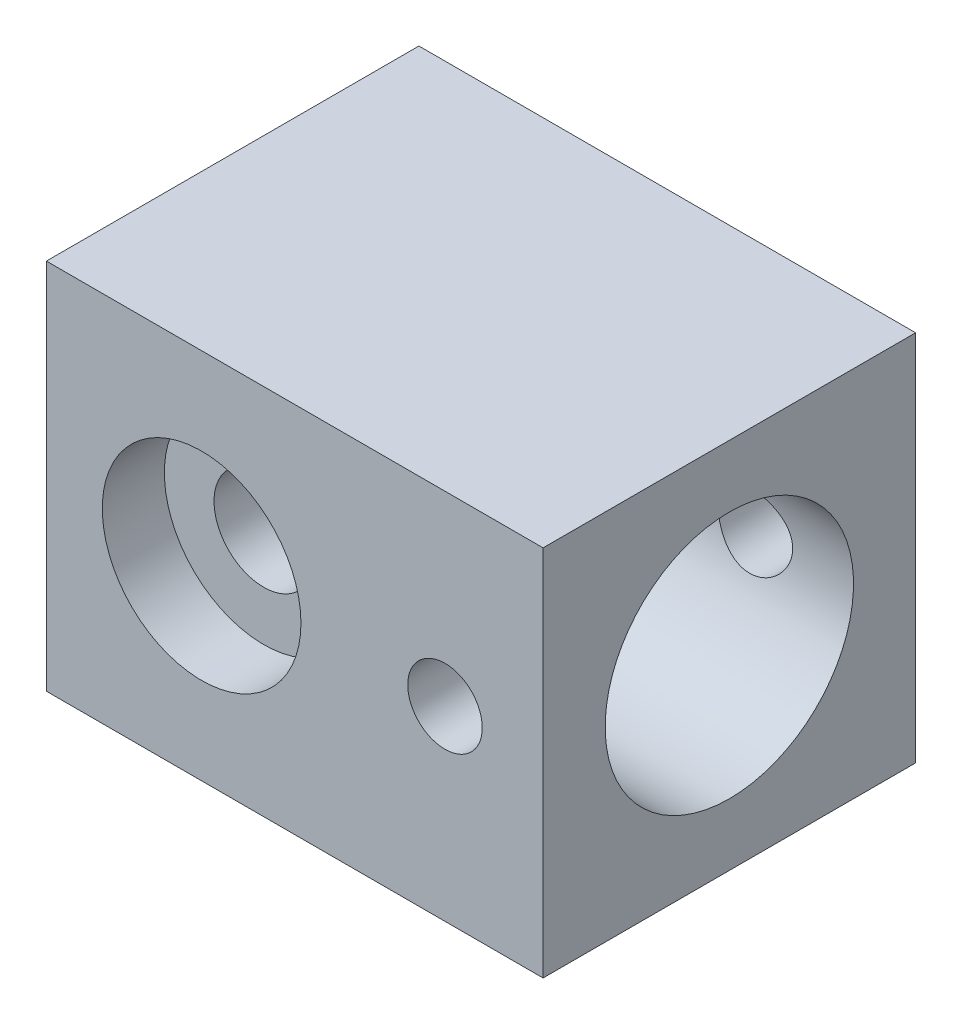
ISO-10303-21;
HEADER;
FILE_DESCRIPTION(('STEP AP214'),'2;1');
FILE_NAME('part.step','',(''),(''),'','','');
FILE_SCHEMA(('AUTOMOTIVE_DESIGN { 1 0 10303 214 1 1 1 1 }'));
ENDSEC;
DATA;
#1=APPLICATION_CONTEXT('core data for automotive mechanical design processes');
#2=APPLICATION_PROTOCOL_DEFINITION('international standard','automotive_design',2000,#1);
#3=PRODUCT_CONTEXT('',#1,'mechanical');
#4=PRODUCT('Part','Part','',(#3));
#5=PRODUCT_RELATED_PRODUCT_CATEGORY('part','',(#4));
#6=PRODUCT_DEFINITION_FORMATION('','',#4);
#7=PRODUCT_DEFINITION_CONTEXT('part definition',#1,'design');
#8=PRODUCT_DEFINITION('design','',#6,#7);
#9=PRODUCT_DEFINITION_SHAPE('','',#8);
#10=(LENGTH_UNIT() NAMED_UNIT(*) SI_UNIT(.MILLI.,.METRE.));
#11=(NAMED_UNIT(*) PLANE_ANGLE_UNIT() SI_UNIT($,.RADIAN.));
#12=(NAMED_UNIT(*) SI_UNIT($,.STERADIAN.) SOLID_ANGLE_UNIT());
#13=UNCERTAINTY_MEASURE_WITH_UNIT(LENGTH_MEASURE(1.E-05),#10,'distance_accuracy_value','');
#14=(GEOMETRIC_REPRESENTATION_CONTEXT(3) GLOBAL_UNCERTAINTY_ASSIGNED_CONTEXT((#13)) GLOBAL_UNIT_ASSIGNED_CONTEXT((#10,
#11,#12)) REPRESENTATION_CONTEXT('',''));
#15=CARTESIAN_POINT('',(0.,0.,0.));
#16=DIRECTION('',(0.,0.,1.));
#17=DIRECTION('',(1.,0.,0.));
#18=AXIS2_PLACEMENT_3D('',#15,#16,#17);
#19=CARTESIAN_POINT('',(0.,0.,0.));
#20=DIRECTION('',(0.,0.,1.));
#21=DIRECTION('',(1.,0.,0.));
#22=AXIS2_PLACEMENT_3D('',#19,#20,#21);
#23=PLANE('',#22);
#24=DIRECTION('',(0.,-1.,0.));
#25=VECTOR('',#24,1.);
#26=CARTESIAN_POINT('',(0.,0.,0.));
#27=LINE('',#26,#25);
#28=CARTESIAN_POINT('',(0.,0.,0.));
#29=VERTEX_POINT('',#28);
#30=CARTESIAN_POINT('',(0.,-30.,0.));
#31=VERTEX_POINT('',#30);
#32=EDGE_CURVE('E118',#29,#31,#27,.T.);
#33=ORIENTED_EDGE('',*,*,#32,.F.);
#34=DIRECTION('',(-1.,0.,0.));
#35=VECTOR('',#34,1.);
#36=CARTESIAN_POINT('',(0.,0.,0.));
#37=LINE('',#36,#35);
#38=CARTESIAN_POINT('',(40.,0.,0.));
#39=VERTEX_POINT('',#38);
#40=EDGE_CURVE('E93',#39,#29,#37,.T.);
#41=ORIENTED_EDGE('',*,*,#40,.F.);
#42=DIRECTION('',(0.,1.,0.));
#43=VECTOR('',#42,1.);
#44=CARTESIAN_POINT('',(40.,0.,0.));
#45=LINE('',#44,#43);
#46=CARTESIAN_POINT('',(40.,-30.,0.));
#47=VERTEX_POINT('',#46);
#48=EDGE_CURVE('E87',#47,#39,#45,.T.);
#49=ORIENTED_EDGE('',*,*,#48,.F.);
#50=DIRECTION('',(1.,0.,0.));
#51=VECTOR('',#50,1.);
#52=CARTESIAN_POINT('',(0.,-30.,0.));
#53=LINE('',#52,#51);
#54=EDGE_CURVE('E109',#31,#47,#53,.T.);
#55=ORIENTED_EDGE('',*,*,#54,.F.);
#56=EDGE_LOOP('',(#33,#41,#49,#55));
#57=FACE_BOUND('',#56,.T.);
#58=CARTESIAN_POINT('',(32.1,-15.,0.));
#59=DIRECTION('',(0.,0.,1.));
#60=DIRECTION('',(1.,0.,0.));
#61=AXIS2_PLACEMENT_3D('',#58,#59,#60);
#62=CIRCLE('',#61,3.);
#63=CARTESIAN_POINT('',(35.1,-15.,0.));
#64=VERTEX_POINT('',#63);
#65=EDGE_CURVE('E200',#64,#64,#62,.T.);
#66=ORIENTED_EDGE('',*,*,#65,.T.);
#67=EDGE_LOOP('',(#66));
#68=FACE_BOUND('',#67,.T.);
#69=CARTESIAN_POINT('',(12.5,-15.,0.));
#70=DIRECTION('',(0.,0.,1.));
#71=DIRECTION('',(1.,0.,0.));
#72=AXIS2_PLACEMENT_3D('',#69,#70,#71);
#73=CIRCLE('',#72,8.);
#74=CARTESIAN_POINT('',(20.5,-15.,0.));
#75=VERTEX_POINT('',#74);
#76=EDGE_CURVE('E206',#75,#75,#73,.T.);
#77=ORIENTED_EDGE('',*,*,#76,.T.);
#78=EDGE_LOOP('',(#77));
#79=FACE_BOUND('',#78,.T.);
#80=ADVANCED_FACE('F46',(#57,#68,#79),#23,.F.);
#81=CARTESIAN_POINT('',(12.5,-15.,-71.));
#82=DIRECTION('',(0.,0.,1.));
#83=DIRECTION('',(1.,0.,0.));
#84=AXIS2_PLACEMENT_3D('',#81,#82,#83);
#85=CYLINDRICAL_SURFACE('',#84,4.);
#86=CARTESIAN_POINT('',(12.5,-15.,25.));
#87=DIRECTION('',(0.,0.,1.));
#88=DIRECTION('',(1.,0.,0.));
#89=AXIS2_PLACEMENT_3D('',#86,#87,#88);
#90=CIRCLE('',#89,4.);
#91=CARTESIAN_POINT('',(16.5,-15.,25.));
#92=VERTEX_POINT('',#91);
#93=EDGE_CURVE('E195',#92,#92,#90,.T.);
#94=ORIENTED_EDGE('',*,*,#93,.T.);
#95=EDGE_LOOP('',(#94));
#96=FACE_BOUND('',#95,.T.);
#97=CARTESIAN_POINT('',(12.5,-15.,5.));
#98=DIRECTION('',(0.,0.,1.));
#99=DIRECTION('',(1.,0.,0.));
#100=AXIS2_PLACEMENT_3D('',#97,#98,#99);
#101=CIRCLE('',#100,4.);
#102=CARTESIAN_POINT('',(16.5,-15.,5.));
#103=VERTEX_POINT('',#102);
#104=EDGE_CURVE('E209',#103,#103,#101,.T.);
#105=ORIENTED_EDGE('',*,*,#104,.F.);
#106=EDGE_LOOP('',(#105));
#107=FACE_BOUND('',#106,.T.);
#108=ADVANCED_FACE('F146',(#96,#107),#85,.F.);
#109=CARTESIAN_POINT('',(0.,0.,30.));
#110=DIRECTION('',(1.,0.,0.));
#111=DIRECTION('',(0.,0.,-1.));
#112=AXIS2_PLACEMENT_3D('',#109,#110,#111);
#113=PLANE('',#112);
#114=ORIENTED_EDGE('',*,*,#32,.T.);
#115=DIRECTION('',(0.,0.,-1.));
#116=VECTOR('',#115,1.);
#117=CARTESIAN_POINT('',(0.,-30.,30.));
#118=LINE('',#117,#116);
#119=CARTESIAN_POINT('',(0.,-30.,30.));
#120=VERTEX_POINT('',#119);
#121=EDGE_CURVE('E12',#120,#31,#118,.T.);
#122=ORIENTED_EDGE('',*,*,#121,.F.);
#123=DIRECTION('',(0.,-1.,0.));
#124=VECTOR('',#123,1.);
#125=CARTESIAN_POINT('',(0.,0.,30.));
#126=LINE('',#125,#124);
#127=CARTESIAN_POINT('',(0.,0.,30.));
#128=VERTEX_POINT('',#127);
#129=EDGE_CURVE('E105',#128,#120,#126,.T.);
#130=ORIENTED_EDGE('',*,*,#129,.F.);
#131=DIRECTION('',(0.,0.,-1.));
#132=VECTOR('',#131,1.);
#133=CARTESIAN_POINT('',(0.,0.,30.));
#134=LINE('',#133,#132);
#135=EDGE_CURVE('E114',#128,#29,#134,.T.);
#136=ORIENTED_EDGE('',*,*,#135,.T.);
#137=EDGE_LOOP('',(#114,#122,#130,#136));
#138=FACE_BOUND('',#137,.T.);
#139=ADVANCED_FACE('F48',(#138),#113,.F.);
#140=CARTESIAN_POINT('',(0.,-30.,30.));
#141=DIRECTION('',(0.,1.,0.));
#142=DIRECTION('',(0.,0.,1.));
#143=AXIS2_PLACEMENT_3D('',#140,#141,#142);
#144=PLANE('',#143);
#145=ORIENTED_EDGE('',*,*,#54,.T.);
#146=DIRECTION('',(0.,0.,-1.));
#147=VECTOR('',#146,1.);
#148=CARTESIAN_POINT('',(40.,-30.,30.));
#149=LINE('',#148,#147);
#150=CARTESIAN_POINT('',(40.,-30.,30.));
#151=VERTEX_POINT('',#150);
#152=EDGE_CURVE('E61',#151,#47,#149,.T.);
#153=ORIENTED_EDGE('',*,*,#152,.F.);
#154=DIRECTION('',(1.,0.,0.));
#155=VECTOR('',#154,1.);
#156=CARTESIAN_POINT('',(0.,-30.,30.));
#157=LINE('',#156,#155);
#158=EDGE_CURVE('E100',#120,#151,#157,.T.);
#159=ORIENTED_EDGE('',*,*,#158,.F.);
#160=ORIENTED_EDGE('',*,*,#121,.T.);
#161=EDGE_LOOP('',(#145,#153,#159,#160));
#162=FACE_BOUND('',#161,.T.);
#163=ADVANCED_FACE('F108',(#162),#144,.F.);
#164=CARTESIAN_POINT('',(40.,0.,30.));
#165=DIRECTION('',(-1.,0.,0.));
#166=DIRECTION('',(0.,-1.,0.));
#167=AXIS2_PLACEMENT_3D('',#164,#165,#166);
#168=PLANE('',#167);
#169=CARTESIAN_POINT('',(40.,-15.,15.));
#170=DIRECTION('',(1.,0.,0.));
#171=DIRECTION('',(0.,1.,0.));
#172=AXIS2_PLACEMENT_3D('',#169,#170,#171);
#173=CIRCLE('',#172,10.);
#174=CARTESIAN_POINT('',(40.,-5.,15.));
#175=VERTEX_POINT('',#174);
#176=EDGE_CURVE('E187',#175,#175,#173,.T.);
#177=ORIENTED_EDGE('',*,*,#176,.F.);
#178=EDGE_LOOP('',(#177));
#179=FACE_BOUND('',#178,.T.);
#180=ORIENTED_EDGE('',*,*,#48,.T.);
#181=DIRECTION('',(0.,0.,-1.));
#182=VECTOR('',#181,1.);
#183=CARTESIAN_POINT('',(40.,0.,30.));
#184=LINE('',#183,#182);
#185=CARTESIAN_POINT('',(40.,0.,30.));
#186=VERTEX_POINT('',#185);
#187=EDGE_CURVE('E110',#186,#39,#184,.T.);
#188=ORIENTED_EDGE('',*,*,#187,.F.);
#189=DIRECTION('',(0.,1.,0.));
#190=VECTOR('',#189,1.);
#191=CARTESIAN_POINT('',(40.,0.,30.));
#192=LINE('',#191,#190);
#193=EDGE_CURVE('E103',#151,#186,#192,.T.);
#194=ORIENTED_EDGE('',*,*,#193,.F.);
#195=ORIENTED_EDGE('',*,*,#152,.T.);
#196=EDGE_LOOP('',(#180,#188,#194,#195));
#197=FACE_BOUND('',#196,.T.);
#198=ADVANCED_FACE('F112',(#179,#197),#168,.F.);
#199=CARTESIAN_POINT('',(0.,0.,30.));
#200=DIRECTION('',(0.,-1.,0.));
#201=DIRECTION('',(0.,0.,-1.));
#202=AXIS2_PLACEMENT_3D('',#199,#200,#201);
#203=PLANE('',#202);
#204=ORIENTED_EDGE('',*,*,#40,.T.);
#205=ORIENTED_EDGE('',*,*,#135,.F.);
#206=DIRECTION('',(-1.,0.,0.));
#207=VECTOR('',#206,1.);
#208=CARTESIAN_POINT('',(0.,0.,30.));
#209=LINE('',#208,#207);
#210=EDGE_CURVE('E70',#186,#128,#209,.T.);
#211=ORIENTED_EDGE('',*,*,#210,.F.);
#212=ORIENTED_EDGE('',*,*,#187,.T.);
#213=EDGE_LOOP('',(#204,#205,#211,#212));
#214=FACE_BOUND('',#213,.T.);
#215=ADVANCED_FACE('F174',(#214),#203,.F.);
#216=CARTESIAN_POINT('',(0.,0.,30.));
#217=DIRECTION('',(0.,0.,1.));
#218=DIRECTION('',(1.,0.,0.));
#219=AXIS2_PLACEMENT_3D('',#216,#217,#218);
#220=PLANE('',#219);
#221=CARTESIAN_POINT('',(32.1,-15.,30.));
#222=DIRECTION('',(0.,0.,1.));
#223=DIRECTION('',(1.,0.,0.));
#224=AXIS2_PLACEMENT_3D('',#221,#222,#223);
#225=CIRCLE('',#224,3.);
#226=CARTESIAN_POINT('',(35.1,-15.,30.));
#227=VERTEX_POINT('',#226);
#228=EDGE_CURVE('E131',#227,#227,#225,.T.);
#229=ORIENTED_EDGE('',*,*,#228,.F.);
#230=EDGE_LOOP('',(#229));
#231=FACE_BOUND('',#230,.T.);
#232=CARTESIAN_POINT('',(12.5,-15.,30.));
#233=DIRECTION('',(0.,0.,1.));
#234=DIRECTION('',(1.,0.,0.));
#235=AXIS2_PLACEMENT_3D('',#232,#233,#234);
#236=CIRCLE('',#235,8.);
#237=CARTESIAN_POINT('',(20.5,-15.,30.));
#238=VERTEX_POINT('',#237);
#239=EDGE_CURVE('E192',#238,#238,#236,.T.);
#240=ORIENTED_EDGE('',*,*,#239,.F.);
#241=EDGE_LOOP('',(#240));
#242=FACE_BOUND('',#241,.T.);
#243=ORIENTED_EDGE('',*,*,#129,.T.);
#244=ORIENTED_EDGE('',*,*,#158,.T.);
#245=ORIENTED_EDGE('',*,*,#193,.T.);
#246=ORIENTED_EDGE('',*,*,#210,.T.);
#247=EDGE_LOOP('',(#243,#244,#245,#246));
#248=FACE_BOUND('',#247,.T.);
#249=ADVANCED_FACE('F101',(#231,#242,#248),#220,.T.);
#250=CARTESIAN_POINT('',(25.,-15.,15.));
#251=DIRECTION('',(1.,0.,0.));
#252=DIRECTION('',(0.,1.,0.));
#253=AXIS2_PLACEMENT_3D('',#250,#251,#252);
#254=CYLINDRICAL_SURFACE('',#253,10.);
#255=CARTESIAN_POINT('',(35.1,-15.,5.));
#256=CARTESIAN_POINT('',(35.0999980050302,-15.1645772255066,5.00000141498899));
#257=CARTESIAN_POINT('',(35.0864122727521,-15.3291746367031,5.00410168612092));
#258=CARTESIAN_POINT('',(35.0325572915558,-15.6535762506098,5.02005788812618));
#259=CARTESIAN_POINT('',(34.9922800839533,-15.8133790088228,5.03191613220616));
#260=CARTESIAN_POINT('',(34.8865079661795,-16.1234654155091,5.06208894996327));
#261=CARTESIAN_POINT('',(34.8210502607621,-16.2737627287907,5.08039399499149));
#262=CARTESIAN_POINT('',(34.6669278138883,-16.5612483621063,5.12155781524709));
#263=CARTESIAN_POINT('',(34.5782599852092,-16.6984349349393,5.14441719615867));
#264=CARTESIAN_POINT('',(34.3775519850547,-16.9597435943675,5.19298525614452));
#265=CARTESIAN_POINT('',(34.2649667482282,-17.0834361424887,5.21875232685927));
#266=CARTESIAN_POINT('',(34.0207815401796,-17.3104984184665,5.26988331579116));
#267=CARTESIAN_POINT('',(33.8891783757501,-17.4138647265488,5.29524716550997));
#268=CARTESIAN_POINT('',(33.6070584939248,-17.5996007544741,5.34331772012456));
#269=CARTESIAN_POINT('',(33.4561830780185,-17.6814461804443,5.36595186672251));
#270=CARTESIAN_POINT('',(33.1420214915394,-17.8184278954952,5.40512759211938));
#271=CARTESIAN_POINT('',(32.9787383121441,-17.8735705983995,5.42167063373379));
#272=CARTESIAN_POINT('',(32.6492194677391,-17.954032673653,5.44618258323131));
#273=CARTESIAN_POINT('',(32.4831945122721,-17.9801439246936,5.45437861350933));
#274=CARTESIAN_POINT('',(32.1489336875665,-18.0042746122934,5.46194420500466));
#275=CARTESIAN_POINT('',(31.9806983638818,-18.0023008552216,5.46131590478858));
#276=CARTESIAN_POINT('',(31.653232182783,-17.9709395439962,5.45150511864444));
#277=CARTESIAN_POINT('',(31.4938954992755,-17.9425441052537,5.44263222801719));
#278=CARTESIAN_POINT('',(31.1823604274531,-17.8607484085411,5.41783287542752));
#279=CARTESIAN_POINT('',(31.0301627452513,-17.8073456828328,5.40190571735299));
#280=CARTESIAN_POINT('',(30.7347993006785,-17.6763205330736,5.36454533850054));
#281=CARTESIAN_POINT('',(30.5917858320895,-17.5983763386929,5.34303967768096));
#282=CARTESIAN_POINT('',(30.3205359559796,-17.4207044517737,5.29698025999871));
#283=CARTESIAN_POINT('',(30.1923031411724,-17.3209714800518,5.27242576506018));
#284=CARTESIAN_POINT('',(29.948627618476,-17.0976258153109,5.22177977404125));
#285=CARTESIAN_POINT('',(29.8339426719407,-16.9731898149339,5.19566691379004));
#286=CARTESIAN_POINT('',(29.6268920318715,-16.7065265186279,5.14575511873483));
#287=CARTESIAN_POINT('',(29.5345277431712,-16.5642981037218,5.1219563296318));
#288=CARTESIAN_POINT('',(29.3742801550705,-16.2647100766856,5.07913679861059));
#289=CARTESIAN_POINT('',(29.3065649675003,-16.1072554994959,5.06014912663372));
#290=CARTESIAN_POINT('',(29.1988008198007,-15.782490831207,5.02932956335556));
#291=CARTESIAN_POINT('',(29.158744142935,-15.6151835031792,5.01749567626001));
#292=CARTESIAN_POINT('',(29.1086956442012,-15.2819044853367,5.00263270712924));
#293=CARTESIAN_POINT('',(29.0976768283968,-15.1161001952024,4.9993029916442));
#294=CARTESIAN_POINT('',(29.1031383114242,-14.7850007883532,5.00094153516481));
#295=CARTESIAN_POINT('',(29.1196149393029,-14.6197056066184,5.00590868644486));
#296=CARTESIAN_POINT('',(29.178769222223,-14.2981927893806,5.02338606025676));
#297=CARTESIAN_POINT('',(29.2208467751617,-14.1418544547717,5.03572340401172));
#298=CARTESIAN_POINT('',(29.3292864655564,-13.838490722091,5.0665130431693));
#299=CARTESIAN_POINT('',(29.3956515220757,-13.6914664459488,5.08496607357813));
#300=CARTESIAN_POINT('',(29.5525063309623,-13.4071256210779,5.12660691297369));
#301=CARTESIAN_POINT('',(29.643518681896,-13.2701123476007,5.1498943834072));
#302=CARTESIAN_POINT('',(29.8464495081056,-13.0129533840397,5.19853062471296));
#303=CARTESIAN_POINT('',(29.9583732237753,-12.8928119352881,5.22387991137581));
#304=CARTESIAN_POINT('',(30.2047746167387,-12.6682851089795,5.27493656261994));
#305=CARTESIAN_POINT('',(30.3399237515437,-12.56463037537,5.30062349934487));
#306=CARTESIAN_POINT('',(30.6262558780269,-12.3814200985569,5.34846969522051));
#307=CARTESIAN_POINT('',(30.7774384491158,-12.3018639234104,5.37062904686879));
#308=CARTESIAN_POINT('',(31.09106498251,-12.1696530574568,5.40865620773691));
#309=CARTESIAN_POINT('',(31.2534523730757,-12.1168730612598,5.424553243265));
#310=CARTESIAN_POINT('',(31.5853759378605,-12.0395653836969,5.44816811260263));
#311=CARTESIAN_POINT('',(31.7549096415661,-12.0150280204215,5.45588874930613));
#312=CARTESIAN_POINT('',(32.0887230367768,-11.9955603103007,5.46200055058442));
#313=CARTESIAN_POINT('',(32.2529273020988,-11.9994388938411,5.46076705299606));
#314=CARTESIAN_POINT('',(32.5782282068012,-12.0338498911139,5.45001197607812));
#315=CARTESIAN_POINT('',(32.739324970361,-12.0643812375059,5.44049072864099));
#316=CARTESIAN_POINT('',(33.0518907982633,-12.1504622239131,5.41448472610757));
#317=CARTESIAN_POINT('',(33.2034545747174,-12.2056964898575,5.39808790895067));
#318=CARTESIAN_POINT('',(33.4952848776414,-12.3393698575785,5.36019442194735));
#319=CARTESIAN_POINT('',(33.6355492352832,-12.4178134007428,5.3386967761492));
#320=CARTESIAN_POINT('',(33.9063262330525,-12.5990247238982,5.29204647144662));
#321=CARTESIAN_POINT('',(34.0362975225204,-12.70257447814,5.2667891967142));
#322=CARTESIAN_POINT('',(34.2774049966162,-12.9296513074044,5.21597359100934));
#323=CARTESIAN_POINT('',(34.3885362789356,-13.053183565731,5.19041518352458));
#324=CARTESIAN_POINT('',(34.5920468245899,-13.3210684756335,5.14098126858427));
#325=CARTESIAN_POINT('',(34.6837828937109,-13.4659242284188,5.11717680468579));
#326=CARTESIAN_POINT('',(34.8414703398081,-13.7697172520329,5.07478639088448));
#327=CARTESIAN_POINT('',(34.907433776549,-13.9286478940021,5.05619800137886));
#328=CARTESIAN_POINT('',(35.0057905513055,-14.2384845746894,5.02795650061381));
#329=CARTESIAN_POINT('',(35.0410233457665,-14.3884260760915,5.0175594523786));
#330=CARTESIAN_POINT('',(35.0881270504832,-14.6922396095384,5.0035811101102));
#331=CARTESIAN_POINT('',(35.1000018654096,-14.8461109802837,4.99999867690521));
#332=CARTESIAN_POINT('',(35.1,-15.,5.));
#333=B_SPLINE_CURVE_WITH_KNOTS('',3,(#255,#256,#257,#258,#259,#260,#261,#262,#263,#264,#265,
#266,#267,#268,#269,#270,#271,#272,#273,#274,#275,#276,#277,#278,#279,#280,#281,#282,#283,#284,
#285,#286,#287,#288,#289,#290,#291,#292,#293,#294,#295,#296,#297,#298,#299,#300,#301,#302,#303,
#304,#305,#306,#307,#308,#309,#310,#311,#312,#313,#314,#315,#316,#317,#318,#319,#320,#321,#322,
#323,#324,#325,#326,#327,#328,#329,#330,#331,#332),.UNSPECIFIED.,.T.,.F.,(4,2,2,2,2,2,2,2,2,2,2,
2,2,2,2,2,2,2,2,2,2,2,2,2,2,2,2,2,2,2,2,2,2,2,2,2,2,2,4),(0.,0.493166407225221,
0.986479929691998,1.47906735260175,1.9717203288254,2.47711205896382,2.98258874577265,
3.49942962008217,4.01614629086447,4.51839378713198,5.02051956638179,5.50452033395352,
5.98856887316002,6.47924852894239,6.97004720317111,7.48134208096333,7.99266913062143,
8.50742093763378,9.02202907057616,9.5181761887709,10.0142570710065,10.4991349336465,
10.9840710918746,11.4802261140582,11.9765056400038,12.4908080064564,13.0050968850536,
13.516956299025,14.0286401892057,14.5190031093854,15.0093463933232,15.4936008081456,
15.9779479511534,16.4799385136898,16.9820594980413,17.4988599232246,18.0154182319959,
18.4766338387004,18.9377723390687),.UNSPECIFIED.);
#334=CARTESIAN_POINT('',(35.1,-15.,5.));
#335=VERTEX_POINT('',#334);
#336=EDGE_CURVE('E50',#335,#335,#333,.T.);
#337=ORIENTED_EDGE('',*,*,#336,.T.);
#338=EDGE_LOOP('',(#337));
#339=FACE_BOUND('',#338,.T.);
#340=CARTESIAN_POINT('',(35.1,-15.,25.));
#341=CARTESIAN_POINT('',(35.0999980050302,-14.8354227744934,24.999998585011));
#342=CARTESIAN_POINT('',(35.0864122727521,-14.6708253632969,24.9958983138791));
#343=CARTESIAN_POINT('',(35.0325572915558,-14.3464237493902,24.9799421118738));
#344=CARTESIAN_POINT('',(34.9922800839533,-14.1866209911772,24.9680838677938));
#345=CARTESIAN_POINT('',(34.8865079661795,-13.8765345844909,24.9379110500367));
#346=CARTESIAN_POINT('',(34.8210502607621,-13.7262372712093,24.9196060050085));
#347=CARTESIAN_POINT('',(34.6669278138883,-13.4387516378937,24.8784421847529));
#348=CARTESIAN_POINT('',(34.5782599852092,-13.3015650650607,24.8555828038413));
#349=CARTESIAN_POINT('',(34.3775519850547,-13.0402564056325,24.8070147438555));
#350=CARTESIAN_POINT('',(34.2649667482282,-12.9165638575113,24.7812476731407));
#351=CARTESIAN_POINT('',(34.0207815401796,-12.6895015815335,24.7301166842088));
#352=CARTESIAN_POINT('',(33.8891783757501,-12.5861352734512,24.70475283449));
#353=CARTESIAN_POINT('',(33.6070584939248,-12.4003992455258,24.6566822798754));
#354=CARTESIAN_POINT('',(33.4561830780185,-12.3185538195557,24.6340481332775));
#355=CARTESIAN_POINT('',(33.1420214915394,-12.1815721045048,24.5948724078806));
#356=CARTESIAN_POINT('',(32.9787383121441,-12.1264294016005,24.5783293662662));
#357=CARTESIAN_POINT('',(32.6492194677391,-12.045967326347,24.5538174167687));
#358=CARTESIAN_POINT('',(32.4831945122721,-12.0198560753064,24.5456213864907));
#359=CARTESIAN_POINT('',(32.1489336875665,-11.9957253877066,24.5380557949953));
#360=CARTESIAN_POINT('',(31.9806983638818,-11.9976991447784,24.5386840952114));
#361=CARTESIAN_POINT('',(31.653232182783,-12.0290604560038,24.5484948813556));
#362=CARTESIAN_POINT('',(31.4938954992755,-12.0574558947463,24.5573677719828));
#363=CARTESIAN_POINT('',(31.1823604274531,-12.1392515914589,24.5821671245725));
#364=CARTESIAN_POINT('',(31.0301627452513,-12.1926543171672,24.598094282647));
#365=CARTESIAN_POINT('',(30.7347993006785,-12.3236794669264,24.6354546614995));
#366=CARTESIAN_POINT('',(30.5917858320895,-12.4016236613071,24.656960322319));
#367=CARTESIAN_POINT('',(30.3205359559796,-12.5792955482263,24.7030197400013));
#368=CARTESIAN_POINT('',(30.1923031411724,-12.6790285199482,24.7275742349398));
#369=CARTESIAN_POINT('',(29.948627618476,-12.9023741846891,24.7782202259587));
#370=CARTESIAN_POINT('',(29.8339426719407,-13.0268101850661,24.80433308621));
#371=CARTESIAN_POINT('',(29.6268920318715,-13.2934734813721,24.8542448812652));
#372=CARTESIAN_POINT('',(29.5345277431711,-13.4357018962782,24.8780436703682));
#373=CARTESIAN_POINT('',(29.3742801550705,-13.7352899233144,24.9208632013894));
#374=CARTESIAN_POINT('',(29.3065649675003,-13.8927445005041,24.9398508733663));
#375=CARTESIAN_POINT('',(29.1988008198007,-14.217509168793,24.9706704366444));
#376=CARTESIAN_POINT('',(29.158744142935,-14.3848164968208,24.98250432374));
#377=CARTESIAN_POINT('',(29.1086956442012,-14.7180955146633,24.9973672928708));
#378=CARTESIAN_POINT('',(29.0976768283968,-14.8838998047976,25.0006970083558));
#379=CARTESIAN_POINT('',(29.1031383114242,-15.2149992116468,24.9990584648352));
#380=CARTESIAN_POINT('',(29.1196149393029,-15.3802943933816,24.9940913135551));
#381=CARTESIAN_POINT('',(29.178769222223,-15.7018072106194,24.9766139397432));
#382=CARTESIAN_POINT('',(29.2208467751617,-15.8581455452283,24.9642765959883));
#383=CARTESIAN_POINT('',(29.3292864655564,-16.161509277909,24.9334869568307));
#384=CARTESIAN_POINT('',(29.3956515220757,-16.3085335540512,24.9150339264219));
#385=CARTESIAN_POINT('',(29.5525063309623,-16.5928743789221,24.8733930870263));
#386=CARTESIAN_POINT('',(29.643518681896,-16.7298876523993,24.8501056165928));
#387=CARTESIAN_POINT('',(29.8464495081056,-16.9870466159603,24.801469375287));
#388=CARTESIAN_POINT('',(29.9583732237753,-17.1071880647119,24.7761200886242));
#389=CARTESIAN_POINT('',(30.2047746167387,-17.3317148910205,24.7250634373801));
#390=CARTESIAN_POINT('',(30.3399237515437,-17.43536962463,24.6993765006551));
#391=CARTESIAN_POINT('',(30.6262558780269,-17.6185799014431,24.6515303047795));
#392=CARTESIAN_POINT('',(30.7774384491158,-17.6981360765897,24.6293709531312));
#393=CARTESIAN_POINT('',(31.09106498251,-17.8303469425432,24.5913437922631));
#394=CARTESIAN_POINT('',(31.2534523730757,-17.8831269387402,24.575446756735));
#395=CARTESIAN_POINT('',(31.5853759378605,-17.9604346163031,24.5518318873974));
#396=CARTESIAN_POINT('',(31.7549096415661,-17.9849719795785,24.5441112506939));
#397=CARTESIAN_POINT('',(32.0887230367768,-18.0044396896993,24.5379994494156));
#398=CARTESIAN_POINT('',(32.2529273020988,-18.0005611061589,24.5392329470039));
#399=CARTESIAN_POINT('',(32.5782282068012,-17.9661501088861,24.5499880239219));
#400=CARTESIAN_POINT('',(32.739324970361,-17.9356187624941,24.559509271359));
#401=CARTESIAN_POINT('',(33.0518907982633,-17.8495377760869,24.5855152738924));
#402=CARTESIAN_POINT('',(33.2034545747174,-17.7943035101425,24.6019120910493));
#403=CARTESIAN_POINT('',(33.4952848776414,-17.6606301424215,24.6398055780527));
#404=CARTESIAN_POINT('',(33.6355492352832,-17.5821865992572,24.6613032238508));
#405=CARTESIAN_POINT('',(33.9063262330525,-17.4009752761018,24.7079535285534));
#406=CARTESIAN_POINT('',(34.0362975225204,-17.29742552186,24.7332108032858));
#407=CARTESIAN_POINT('',(34.2774049966162,-17.0703486925956,24.7840264089907));
#408=CARTESIAN_POINT('',(34.3885362789356,-16.946816434269,24.8095848164754));
#409=CARTESIAN_POINT('',(34.5920468245899,-16.6789315243665,24.8590187314157));
#410=CARTESIAN_POINT('',(34.6837828937109,-16.5340757715812,24.8828231953142));
#411=CARTESIAN_POINT('',(34.8414703398081,-16.2302827479671,24.9252136091155));
#412=CARTESIAN_POINT('',(34.907433776549,-16.0713521059979,24.9438019986211));
#413=CARTESIAN_POINT('',(35.0057905513055,-15.7615154253106,24.9720434993862));
#414=CARTESIAN_POINT('',(35.0410233457665,-15.6115739239085,24.9824405476214));
#415=CARTESIAN_POINT('',(35.0881270504832,-15.3077603904616,24.9964188898898));
#416=CARTESIAN_POINT('',(35.1000018654096,-15.1538890197163,25.0000013230948));
#417=CARTESIAN_POINT('',(35.1,-15.,25.));
#418=B_SPLINE_CURVE_WITH_KNOTS('',3,(#340,#341,#342,#343,#344,#345,#346,#347,#348,#349,#350,
#351,#352,#353,#354,#355,#356,#357,#358,#359,#360,#361,#362,#363,#364,#365,#366,#367,#368,#369,
#370,#371,#372,#373,#374,#375,#376,#377,#378,#379,#380,#381,#382,#383,#384,#385,#386,#387,#388,
#389,#390,#391,#392,#393,#394,#395,#396,#397,#398,#399,#400,#401,#402,#403,#404,#405,#406,#407,
#408,#409,#410,#411,#412,#413,#414,#415,#416,#417),.UNSPECIFIED.,.T.,.F.,(4,2,2,2,2,2,2,2,2,2,2,
2,2,2,2,2,2,2,2,2,2,2,2,2,2,2,2,2,2,2,2,2,2,2,2,2,2,2,4),(0.,0.493166407225221,
0.986479929691998,1.47906735260175,1.9717203288254,2.47711205896383,2.98258874577266,
3.49942962008218,4.01614629086447,4.51839378713198,5.02051956638179,5.50452033395352,
5.98856887316002,6.47924852894239,6.97004720317111,7.48134208096333,7.99266913062143,
8.50742093763377,9.02202907057615,9.5181761887709,10.0142570710065,10.4991349336465,
10.9840710918746,11.4802261140582,11.9765056400038,12.4908080064564,13.0050968850536,
13.516956299025,14.0286401892057,14.5190031093854,15.0093463933232,15.4936008081456,
15.9779479511533,16.4799385136898,16.9820594980413,17.4988599232246,18.0154182319959,
18.4766338387004,18.9377723390687),.UNSPECIFIED.);
#419=CARTESIAN_POINT('',(35.1,-15.,25.));
#420=VERTEX_POINT('',#419);
#421=EDGE_CURVE('E126',#420,#420,#418,.T.);
#422=ORIENTED_EDGE('',*,*,#421,.T.);
#423=EDGE_LOOP('',(#422));
#424=FACE_BOUND('',#423,.T.);
#425=CARTESIAN_POINT('',(25.,-15.,15.));
#426=DIRECTION('',(1.,0.,0.));
#427=DIRECTION('',(0.,1.,0.));
#428=AXIS2_PLACEMENT_3D('',#425,#426,#427);
#429=CIRCLE('',#428,10.);
#430=CARTESIAN_POINT('',(25.,-5.00000000000001,15.));
#431=VERTEX_POINT('',#430);
#432=EDGE_CURVE('E121',#431,#431,#429,.T.);
#433=ORIENTED_EDGE('',*,*,#432,.F.);
#434=EDGE_LOOP('',(#433));
#435=FACE_BOUND('',#434,.T.);
#436=ORIENTED_EDGE('',*,*,#176,.T.);
#437=EDGE_LOOP('',(#436));
#438=FACE_BOUND('',#437,.T.);
#439=ADVANCED_FACE('F132',(#339,#424,#435,#438),#254,.F.);
#440=CARTESIAN_POINT('',(25.,-15.,15.));
#441=DIRECTION('',(1.,0.,0.));
#442=DIRECTION('',(0.,1.,0.));
#443=AXIS2_PLACEMENT_3D('',#440,#441,#442);
#444=PLANE('',#443);
#445=ORIENTED_EDGE('',*,*,#432,.T.);
#446=EDGE_LOOP('',(#445));
#447=FACE_BOUND('',#446,.T.);
#448=ADVANCED_FACE('F157',(#447),#444,.T.);
#449=CARTESIAN_POINT('',(12.5,-15.,25.));
#450=DIRECTION('',(0.,0.,1.));
#451=DIRECTION('',(1.,0.,0.));
#452=AXIS2_PLACEMENT_3D('',#449,#450,#451);
#453=CYLINDRICAL_SURFACE('',#452,8.);
#454=CARTESIAN_POINT('',(12.5,-15.,25.));
#455=DIRECTION('',(0.,0.,1.));
#456=DIRECTION('',(1.,0.,0.));
#457=AXIS2_PLACEMENT_3D('',#454,#455,#456);
#458=CIRCLE('',#457,8.);
#459=CARTESIAN_POINT('',(20.5,-15.,25.));
#460=VERTEX_POINT('',#459);
#461=EDGE_CURVE('E190',#460,#460,#458,.T.);
#462=ORIENTED_EDGE('',*,*,#461,.F.);
#463=EDGE_LOOP('',(#462));
#464=FACE_BOUND('',#463,.T.);
#465=ORIENTED_EDGE('',*,*,#239,.T.);
#466=EDGE_LOOP('',(#465));
#467=FACE_BOUND('',#466,.T.);
#468=ADVANCED_FACE('F154',(#464,#467),#453,.F.);
#469=CARTESIAN_POINT('',(12.5,-15.,25.));
#470=DIRECTION('',(0.,0.,1.));
#471=DIRECTION('',(1.,0.,0.));
#472=AXIS2_PLACEMENT_3D('',#469,#470,#471);
#473=PLANE('',#472);
#474=ORIENTED_EDGE('',*,*,#93,.F.);
#475=EDGE_LOOP('',(#474));
#476=FACE_BOUND('',#475,.T.);
#477=ORIENTED_EDGE('',*,*,#461,.T.);
#478=EDGE_LOOP('',(#477));
#479=FACE_BOUND('',#478,.T.);
#480=ADVANCED_FACE('F151',(#476,#479),#473,.T.);
#481=CARTESIAN_POINT('',(32.1,-15.,-71.));
#482=DIRECTION('',(0.,0.,1.));
#483=DIRECTION('',(1.,0.,0.));
#484=AXIS2_PLACEMENT_3D('',#481,#482,#483);
#485=CYLINDRICAL_SURFACE('',#484,3.);
#486=ORIENTED_EDGE('',*,*,#228,.T.);
#487=EDGE_LOOP('',(#486));
#488=FACE_BOUND('',#487,.T.);
#489=ORIENTED_EDGE('',*,*,#421,.F.);
#490=EDGE_LOOP('',(#489));
#491=FACE_BOUND('',#490,.T.);
#492=ADVANCED_FACE('F142',(#488,#491),#485,.F.);
#493=ORIENTED_EDGE('',*,*,#336,.F.);
#494=EDGE_LOOP('',(#493));
#495=FACE_BOUND('',#494,.T.);
#496=ORIENTED_EDGE('',*,*,#65,.F.);
#497=EDGE_LOOP('',(#496));
#498=FACE_BOUND('',#497,.T.);
#499=ADVANCED_FACE('F136',(#495,#498),#485,.F.);
#500=CARTESIAN_POINT('',(12.5,-15.,5.));
#501=DIRECTION('',(0.,0.,-1.));
#502=DIRECTION('',(1.,0.,0.));
#503=AXIS2_PLACEMENT_3D('',#500,#501,#502);
#504=PLANE('',#503);
#505=CARTESIAN_POINT('',(12.5,-15.,5.));
#506=DIRECTION('',(0.,0.,1.));
#507=DIRECTION('',(1.,0.,0.));
#508=AXIS2_PLACEMENT_3D('',#505,#506,#507);
#509=CIRCLE('',#508,8.);
#510=CARTESIAN_POINT('',(20.5,-15.,5.));
#511=VERTEX_POINT('',#510);
#512=EDGE_CURVE('E205',#511,#511,#509,.T.);
#513=ORIENTED_EDGE('',*,*,#512,.F.);
#514=EDGE_LOOP('',(#513));
#515=FACE_BOUND('',#514,.T.);
#516=ORIENTED_EDGE('',*,*,#104,.T.);
#517=EDGE_LOOP('',(#516));
#518=FACE_BOUND('',#517,.T.);
#519=ADVANCED_FACE('F141',(#515,#518),#504,.T.);
#520=CARTESIAN_POINT('',(12.5,-15.,5.));
#521=DIRECTION('',(0.,0.,-1.));
#522=DIRECTION('',(-1.,0.,0.));
#523=AXIS2_PLACEMENT_3D('',#520,#521,#522);
#524=CYLINDRICAL_SURFACE('',#523,8.);
#525=ORIENTED_EDGE('',*,*,#512,.T.);
#526=EDGE_LOOP('',(#525));
#527=FACE_BOUND('',#526,.T.);
#528=ORIENTED_EDGE('',*,*,#76,.F.);
#529=EDGE_LOOP('',(#528));
#530=FACE_BOUND('',#529,.T.);
#531=ADVANCED_FACE('F144',(#527,#530),#524,.F.);
#532=CLOSED_SHELL('',(#80,#108,#139,#163,#198,#215,#249,#439,#448,#468,#480,#492,#499,#519,#531));
#533=MANIFOLD_SOLID_BREP('B2',#532);
#534=ADVANCED_BREP_SHAPE_REPRESENTATION('',(#18,#533),#14);
#535=SHAPE_DEFINITION_REPRESENTATION(#9,#534);
ENDSEC;
END-ISO-10303-21;
